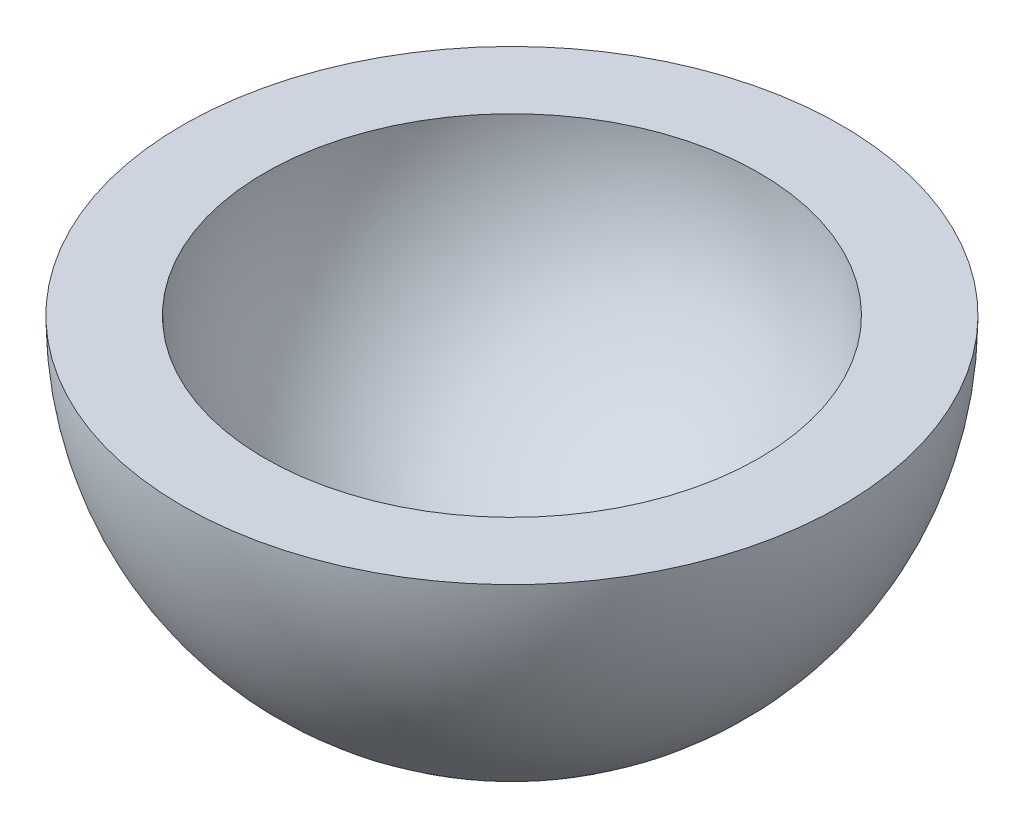
ISO-10303-21;
HEADER;
FILE_DESCRIPTION(('STEP AP214'),'2;1');
FILE_NAME('part.step','',(''),(''),'','','');
FILE_SCHEMA(('AUTOMOTIVE_DESIGN { 1 0 10303 214 1 1 1 1 }'));
ENDSEC;
DATA;
#1=APPLICATION_CONTEXT('core data for automotive mechanical design processes');
#2=APPLICATION_PROTOCOL_DEFINITION('international standard','automotive_design',2000,#1);
#3=PRODUCT_CONTEXT('',#1,'mechanical');
#4=PRODUCT('Part','Part','',(#3));
#5=PRODUCT_RELATED_PRODUCT_CATEGORY('part','',(#4));
#6=PRODUCT_DEFINITION_FORMATION('','',#4);
#7=PRODUCT_DEFINITION_CONTEXT('part definition',#1,'design');
#8=PRODUCT_DEFINITION('design','',#6,#7);
#9=PRODUCT_DEFINITION_SHAPE('','',#8);
#10=(LENGTH_UNIT() NAMED_UNIT(*) SI_UNIT(.MILLI.,.METRE.));
#11=(NAMED_UNIT(*) PLANE_ANGLE_UNIT() SI_UNIT($,.RADIAN.));
#12=(NAMED_UNIT(*) SI_UNIT($,.STERADIAN.) SOLID_ANGLE_UNIT());
#13=UNCERTAINTY_MEASURE_WITH_UNIT(LENGTH_MEASURE(1.E-05),#10,'distance_accuracy_value','');
#14=(GEOMETRIC_REPRESENTATION_CONTEXT(3) GLOBAL_UNCERTAINTY_ASSIGNED_CONTEXT((#13)) GLOBAL_UNIT_ASSIGNED_CONTEXT((#10,
#11,#12)) REPRESENTATION_CONTEXT('',''));
#15=CARTESIAN_POINT('',(0.,0.,0.));
#16=DIRECTION('',(0.,0.,1.));
#17=DIRECTION('',(1.,0.,0.));
#18=AXIS2_PLACEMENT_3D('',#15,#16,#17);
#19=CARTESIAN_POINT('',(0.,0.,0.));
#20=DIRECTION('',(0.,0.,-1.));
#21=DIRECTION('',(-1.,0.,0.));
#22=AXIS2_PLACEMENT_3D('',#19,#20,#21);
#23=SPHERICAL_SURFACE('',#22,8.);
#24=CARTESIAN_POINT('',(0.,0.,0.));
#25=DIRECTION('',(0.,-1.,0.));
#26=DIRECTION('',(0.,0.,1.));
#27=AXIS2_PLACEMENT_3D('',#24,#25,#26);
#28=SPHERICAL_SURFACE('',#27,8.);
#29=CARTESIAN_POINT('',(0.,0.,0.));
#30=DIRECTION('',(0.,-1.,0.));
#31=DIRECTION('',(0.,0.,1.));
#32=AXIS2_PLACEMENT_3D('',#29,#30,#31);
#33=CIRCLE('',#32,8.);
#34=CARTESIAN_POINT('',(0.,0.,8.));
#35=VERTEX_POINT('',#34);
#36=EDGE_CURVE('E10',#35,#35,#33,.T.);
#37=ORIENTED_EDGE('',*,*,#36,.T.);
#38=EDGE_LOOP('',(#37));
#39=FACE_BOUND('',#38,.T.);
#40=ADVANCED_FACE('F35',(#39),#28,.T.);
#41=CARTESIAN_POINT('',(0.,0.,0.));
#42=DIRECTION('',(0.,-1.,0.));
#43=DIRECTION('',(0.,0.,1.));
#44=AXIS2_PLACEMENT_3D('',#41,#42,#43);
#45=PLANE('',#44);
#46=CARTESIAN_POINT('',(0.,0.,0.));
#47=DIRECTION('',(0.,-1.,0.));
#48=DIRECTION('',(1.,0.,0.));
#49=AXIS2_PLACEMENT_3D('',#46,#47,#48);
#50=CIRCLE('',#49,6.);
#51=CARTESIAN_POINT('',(6.,0.,0.));
#52=VERTEX_POINT('',#51);
#53=EDGE_CURVE('E38',#52,#52,#50,.T.);
#54=ORIENTED_EDGE('',*,*,#53,.T.);
#55=EDGE_LOOP('',(#54));
#56=FACE_BOUND('',#55,.T.);
#57=ORIENTED_EDGE('',*,*,#36,.F.);
#58=EDGE_LOOP('',(#57));
#59=FACE_BOUND('',#58,.T.);
#60=ADVANCED_FACE('F47',(#56,#59),#45,.F.);
#61=CARTESIAN_POINT('',(0.,0.,0.));
#62=DIRECTION('',(0.,0.,-1.));
#63=DIRECTION('',(1.,0.,0.));
#64=AXIS2_PLACEMENT_3D('',#61,#62,#63);
#65=SPHERICAL_SURFACE('',#64,6.);
#66=CARTESIAN_POINT('',(0.,0.,0.));
#67=DIRECTION('',(0.,-1.,0.));
#68=DIRECTION('',(1.,0.,0.));
#69=AXIS2_PLACEMENT_3D('',#66,#67,#68);
#70=SPHERICAL_SURFACE('',#69,6.);
#71=ORIENTED_EDGE('',*,*,#53,.F.);
#72=EDGE_LOOP('',(#71));
#73=FACE_BOUND('',#72,.T.);
#74=ADVANCED_FACE('F50',(#73),#70,.F.);
#75=CLOSED_SHELL('',(#40,#60,#74));
#76=MANIFOLD_SOLID_BREP('B2',#75);
#77=ADVANCED_BREP_SHAPE_REPRESENTATION('',(#18,#76),#14);
#78=SHAPE_DEFINITION_REPRESENTATION(#9,#77);
ENDSEC;
END-ISO-10303-21;
